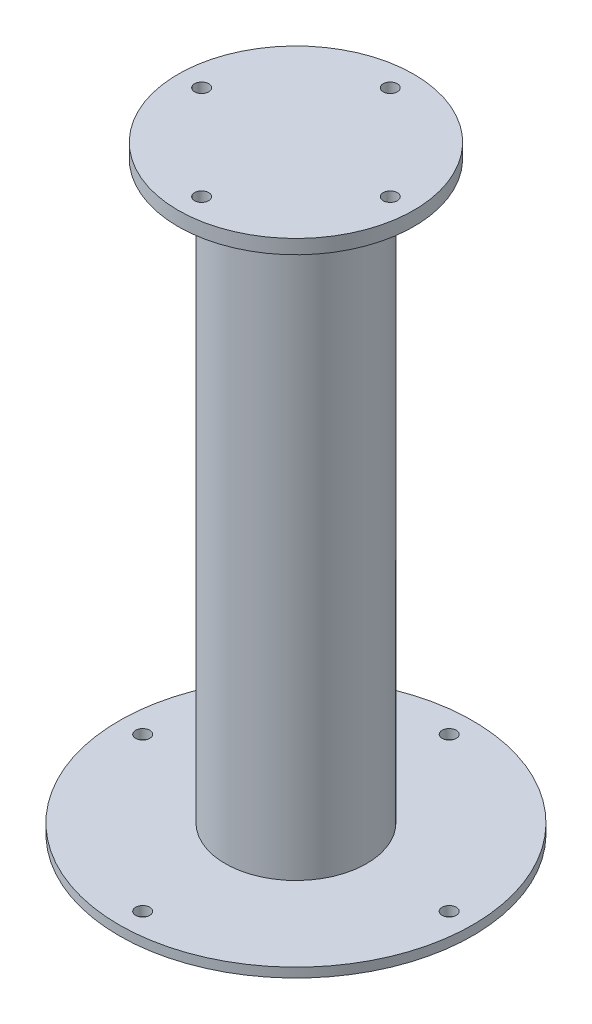
ISO-10303-21;
HEADER;
FILE_DESCRIPTION(('STEP AP214'),'2;1');
FILE_NAME('part.step','',(''),(''),'','','');
FILE_SCHEMA(('AUTOMOTIVE_DESIGN { 1 0 10303 214 1 1 1 1 }'));
ENDSEC;
DATA;
#1=APPLICATION_CONTEXT('core data for automotive mechanical design processes');
#2=APPLICATION_PROTOCOL_DEFINITION('international standard','automotive_design',2000,#1);
#3=PRODUCT_CONTEXT('',#1,'mechanical');
#4=PRODUCT('Part','Part','',(#3));
#5=PRODUCT_RELATED_PRODUCT_CATEGORY('part','',(#4));
#6=PRODUCT_DEFINITION_FORMATION('','',#4);
#7=PRODUCT_DEFINITION_CONTEXT('part definition',#1,'design');
#8=PRODUCT_DEFINITION('design','',#6,#7);
#9=PRODUCT_DEFINITION_SHAPE('','',#8);
#10=(LENGTH_UNIT() NAMED_UNIT(*) SI_UNIT(.MILLI.,.METRE.));
#11=(NAMED_UNIT(*) PLANE_ANGLE_UNIT() SI_UNIT($,.RADIAN.));
#12=(NAMED_UNIT(*) SI_UNIT($,.STERADIAN.) SOLID_ANGLE_UNIT());
#13=UNCERTAINTY_MEASURE_WITH_UNIT(LENGTH_MEASURE(1.E-05),#10,'distance_accuracy_value','');
#14=(GEOMETRIC_REPRESENTATION_CONTEXT(3) GLOBAL_UNCERTAINTY_ASSIGNED_CONTEXT((#13)) GLOBAL_UNIT_ASSIGNED_CONTEXT((#10,
#11,#12)) REPRESENTATION_CONTEXT('',''));
#15=CARTESIAN_POINT('',(0.,0.,0.));
#16=DIRECTION('',(0.,0.,1.));
#17=DIRECTION('',(1.,0.,0.));
#18=AXIS2_PLACEMENT_3D('',#15,#16,#17);
#19=CARTESIAN_POINT('',(0.,2.,0.));
#20=DIRECTION('',(0.,-1.,0.));
#21=DIRECTION('',(0.,0.,-1.));
#22=AXIS2_PLACEMENT_3D('',#19,#20,#21);
#23=CYLINDRICAL_SURFACE('',#22,37.5);
#24=CARTESIAN_POINT('',(0.,2.,0.));
#25=DIRECTION('',(0.,1.,0.));
#26=DIRECTION('',(0.,0.,1.));
#27=AXIS2_PLACEMENT_3D('',#24,#25,#26);
#28=CIRCLE('',#27,37.5);
#29=CARTESIAN_POINT('',(0.,2.,37.5));
#30=VERTEX_POINT('',#29);
#31=EDGE_CURVE('E51',#30,#30,#28,.T.);
#32=ORIENTED_EDGE('',*,*,#31,.F.);
#33=EDGE_LOOP('',(#32));
#34=FACE_BOUND('',#33,.T.);
#35=CARTESIAN_POINT('',(0.,0.,0.));
#36=DIRECTION('',(0.,1.,0.));
#37=DIRECTION('',(0.,0.,1.));
#38=AXIS2_PLACEMENT_3D('',#35,#36,#37);
#39=CIRCLE('',#38,37.5);
#40=CARTESIAN_POINT('',(0.,0.,37.5));
#41=VERTEX_POINT('',#40);
#42=EDGE_CURVE('E46',#41,#41,#39,.T.);
#43=ORIENTED_EDGE('',*,*,#42,.T.);
#44=EDGE_LOOP('',(#43));
#45=FACE_BOUND('',#44,.T.);
#46=ADVANCED_FACE('F43',(#34,#45),#23,.T.);
#47=CARTESIAN_POINT('',(0.,2.,0.));
#48=DIRECTION('',(0.,1.,0.));
#49=DIRECTION('',(0.,0.,1.));
#50=AXIS2_PLACEMENT_3D('',#47,#48,#49);
#51=PLANE('',#50);
#52=CARTESIAN_POINT('',(0.,2.,32.5));
#53=DIRECTION('',(0.,1.,0.));
#54=DIRECTION('',(0.,0.,1.));
#55=AXIS2_PLACEMENT_3D('',#52,#53,#54);
#56=CIRCLE('',#55,1.5);
#57=CARTESIAN_POINT('',(0.,2.,34.));
#58=VERTEX_POINT('',#57);
#59=EDGE_CURVE('E128',#58,#58,#56,.F.);
#60=ORIENTED_EDGE('',*,*,#59,.T.);
#61=EDGE_LOOP('',(#60));
#62=FACE_BOUND('',#61,.T.);
#63=CARTESIAN_POINT('',(32.5,2.,-1.13473143512402E-13));
#64=DIRECTION('',(0.,1.,0.));
#65=DIRECTION('',(0.,0.,1.));
#66=AXIS2_PLACEMENT_3D('',#63,#64,#65);
#67=CIRCLE('',#66,1.5);
#68=CARTESIAN_POINT('',(32.5,2.,1.49999999999989));
#69=VERTEX_POINT('',#68);
#70=EDGE_CURVE('E124',#69,#69,#67,.F.);
#71=ORIENTED_EDGE('',*,*,#70,.T.);
#72=EDGE_LOOP('',(#71));
#73=FACE_BOUND('',#72,.T.);
#74=CARTESIAN_POINT('',(-2.26946287024804E-13,2.,-32.5));
#75=DIRECTION('',(0.,1.,0.));
#76=DIRECTION('',(0.,0.,1.));
#77=AXIS2_PLACEMENT_3D('',#74,#75,#76);
#78=CIRCLE('',#77,1.5);
#79=CARTESIAN_POINT('',(-2.26946287024804E-13,2.,-31.));
#80=VERTEX_POINT('',#79);
#81=EDGE_CURVE('E116',#80,#80,#78,.F.);
#82=ORIENTED_EDGE('',*,*,#81,.T.);
#83=EDGE_LOOP('',(#82));
#84=FACE_BOUND('',#83,.T.);
#85=CARTESIAN_POINT('',(-32.5,2.,3.40419430537206E-13));
#86=DIRECTION('',(0.,1.,0.));
#87=DIRECTION('',(0.,0.,1.));
#88=AXIS2_PLACEMENT_3D('',#85,#86,#87);
#89=CIRCLE('',#88,1.5);
#90=CARTESIAN_POINT('',(-32.5,2.,1.50000000000034));
#91=VERTEX_POINT('',#90);
#92=EDGE_CURVE('E107',#91,#91,#89,.F.);
#93=ORIENTED_EDGE('',*,*,#92,.T.);
#94=EDGE_LOOP('',(#93));
#95=FACE_BOUND('',#94,.T.);
#96=CARTESIAN_POINT('',(0.,2.,0.));
#97=DIRECTION('',(0.,1.,0.));
#98=DIRECTION('',(0.,0.,1.));
#99=AXIS2_PLACEMENT_3D('',#96,#97,#98);
#100=CIRCLE('',#99,15.);
#101=CARTESIAN_POINT('',(0.,1.99999999999999,-15.));
#102=VERTEX_POINT('',#101);
#103=EDGE_CURVE('E10',#102,#102,#100,.T.);
#104=ORIENTED_EDGE('',*,*,#103,.F.);
#105=EDGE_LOOP('',(#104));
#106=FACE_BOUND('',#105,.T.);
#107=ORIENTED_EDGE('',*,*,#31,.T.);
#108=EDGE_LOOP('',(#107));
#109=FACE_BOUND('',#108,.T.);
#110=ADVANCED_FACE('F160',(#62,#73,#84,#95,#106,#109),#51,.T.);
#111=CARTESIAN_POINT('',(0.,0.,0.));
#112=DIRECTION('',(0.,1.,0.));
#113=DIRECTION('',(0.,0.,1.));
#114=AXIS2_PLACEMENT_3D('',#111,#112,#113);
#115=PLANE('',#114);
#116=CARTESIAN_POINT('',(0.,0.,0.));
#117=DIRECTION('',(0.,1.,0.));
#118=DIRECTION('',(0.,0.,1.));
#119=AXIS2_PLACEMENT_3D('',#116,#117,#118);
#120=CIRCLE('',#119,13.);
#121=CARTESIAN_POINT('',(0.,0.,-13.));
#122=VERTEX_POINT('',#121);
#123=EDGE_CURVE('E138',#122,#122,#120,.T.);
#124=ORIENTED_EDGE('',*,*,#123,.T.);
#125=EDGE_LOOP('',(#124));
#126=FACE_BOUND('',#125,.T.);
#127=CARTESIAN_POINT('',(0.,0.,32.5));
#128=DIRECTION('',(0.,-1.,0.));
#129=DIRECTION('',(0.,0.,-1.));
#130=AXIS2_PLACEMENT_3D('',#127,#128,#129);
#131=CIRCLE('',#130,1.5);
#132=CARTESIAN_POINT('',(0.,0.,31.));
#133=VERTEX_POINT('',#132);
#134=EDGE_CURVE('E80',#133,#133,#131,.T.);
#135=ORIENTED_EDGE('',*,*,#134,.F.);
#136=EDGE_LOOP('',(#135));
#137=FACE_BOUND('',#136,.T.);
#138=CARTESIAN_POINT('',(32.5,0.,-1.13473143512402E-13));
#139=DIRECTION('',(0.,-1.,0.));
#140=DIRECTION('',(0.,0.,-1.));
#141=AXIS2_PLACEMENT_3D('',#138,#139,#140);
#142=CIRCLE('',#141,1.5);
#143=CARTESIAN_POINT('',(32.5,0.,-1.50000000000011));
#144=VERTEX_POINT('',#143);
#145=EDGE_CURVE('E120',#144,#144,#142,.T.);
#146=ORIENTED_EDGE('',*,*,#145,.F.);
#147=EDGE_LOOP('',(#146));
#148=FACE_BOUND('',#147,.T.);
#149=CARTESIAN_POINT('',(-2.26946287024804E-13,0.,-32.5));
#150=DIRECTION('',(0.,-1.,0.));
#151=DIRECTION('',(0.,0.,-1.));
#152=AXIS2_PLACEMENT_3D('',#149,#150,#151);
#153=CIRCLE('',#152,1.5);
#154=CARTESIAN_POINT('',(-2.26946287024804E-13,0.,-34.));
#155=VERTEX_POINT('',#154);
#156=EDGE_CURVE('E112',#155,#155,#153,.T.);
#157=ORIENTED_EDGE('',*,*,#156,.F.);
#158=EDGE_LOOP('',(#157));
#159=FACE_BOUND('',#158,.T.);
#160=CARTESIAN_POINT('',(-32.5,0.,3.40419430537206E-13));
#161=DIRECTION('',(0.,-1.,0.));
#162=DIRECTION('',(0.,0.,-1.));
#163=AXIS2_PLACEMENT_3D('',#160,#161,#162);
#164=CIRCLE('',#163,1.5);
#165=CARTESIAN_POINT('',(-32.5,0.,-1.49999999999966));
#166=VERTEX_POINT('',#165);
#167=EDGE_CURVE('E103',#166,#166,#164,.T.);
#168=ORIENTED_EDGE('',*,*,#167,.F.);
#169=EDGE_LOOP('',(#168));
#170=FACE_BOUND('',#169,.T.);
#171=ORIENTED_EDGE('',*,*,#42,.F.);
#172=EDGE_LOOP('',(#171));
#173=FACE_BOUND('',#172,.T.);
#174=ADVANCED_FACE('F143',(#126,#137,#148,#159,#170,#173),#115,.F.);
#175=CARTESIAN_POINT('',(0.,63.,0.));
#176=DIRECTION('',(0.,-1.,0.));
#177=DIRECTION('',(0.,0.,-1.));
#178=AXIS2_PLACEMENT_3D('',#175,#176,#177);
#179=CYLINDRICAL_SURFACE('',#178,15.);
#180=CARTESIAN_POINT('',(0.,124.,0.));
#181=DIRECTION('',(0.,1.,0.));
#182=DIRECTION('',(0.,0.,1.));
#183=AXIS2_PLACEMENT_3D('',#180,#181,#182);
#184=CIRCLE('',#183,15.);
#185=CARTESIAN_POINT('',(0.,124.,-15.));
#186=VERTEX_POINT('',#185);
#187=EDGE_CURVE('E58',#186,#186,#184,.T.);
#188=CARTESIAN_POINT('',(0.,1.99999999999999,-15.));
#189=CARTESIAN_POINT('',(0.,3.27083333333333,-15.));
#190=CARTESIAN_POINT('',(0.,4.54166666666666,-15.));
#191=CARTESIAN_POINT('',(0.,7.08333333333333,-15.));
#192=CARTESIAN_POINT('',(0.,8.35416666666666,-15.));
#193=CARTESIAN_POINT('',(0.,10.8958333333333,-15.));
#194=CARTESIAN_POINT('',(0.,12.1666666666667,-15.));
#195=CARTESIAN_POINT('',(0.,14.7083333333333,-15.));
#196=CARTESIAN_POINT('',(0.,15.9791666666667,-15.));
#197=CARTESIAN_POINT('',(0.,18.5208333333333,-15.));
#198=CARTESIAN_POINT('',(0.,19.7916666666667,-15.));
#199=CARTESIAN_POINT('',(0.,22.3333333333333,-15.));
#200=CARTESIAN_POINT('',(0.,23.6041666666667,-15.));
#201=CARTESIAN_POINT('',(0.,26.1458333333333,-15.));
#202=CARTESIAN_POINT('',(0.,27.4166666666667,-15.));
#203=CARTESIAN_POINT('',(0.,29.9583333333333,-15.));
#204=CARTESIAN_POINT('',(0.,31.2291666666667,-15.));
#205=CARTESIAN_POINT('',(0.,33.7708333333333,-15.));
#206=CARTESIAN_POINT('',(0.,35.0416666666667,-15.));
#207=CARTESIAN_POINT('',(0.,37.5833333333333,-15.));
#208=CARTESIAN_POINT('',(0.,38.8541666666667,-15.));
#209=CARTESIAN_POINT('',(0.,41.3958333333333,-15.));
#210=CARTESIAN_POINT('',(0.,42.6666666666667,-15.));
#211=CARTESIAN_POINT('',(0.,45.2083333333333,-15.));
#212=CARTESIAN_POINT('',(0.,46.4791666666667,-15.));
#213=CARTESIAN_POINT('',(0.,49.0208333333333,-15.));
#214=CARTESIAN_POINT('',(0.,50.2916666666667,-15.));
#215=CARTESIAN_POINT('',(0.,52.8333333333333,-15.));
#216=CARTESIAN_POINT('',(0.,54.1041666666667,-15.));
#217=CARTESIAN_POINT('',(0.,56.6458333333333,-15.));
#218=CARTESIAN_POINT('',(0.,57.9166666666667,-15.));
#219=CARTESIAN_POINT('',(0.,60.4583333333333,-15.));
#220=CARTESIAN_POINT('',(0.,61.7291666666667,-15.));
#221=CARTESIAN_POINT('',(0.,64.2708333333333,-15.));
#222=CARTESIAN_POINT('',(0.,65.5416666666667,-15.));
#223=CARTESIAN_POINT('',(0.,68.0833333333333,-15.));
#224=CARTESIAN_POINT('',(0.,69.3541666666667,-15.));
#225=CARTESIAN_POINT('',(0.,71.8958333333333,-15.));
#226=CARTESIAN_POINT('',(0.,73.1666666666667,-15.));
#227=CARTESIAN_POINT('',(0.,75.7083333333333,-15.));
#228=CARTESIAN_POINT('',(0.,76.9791666666667,-15.));
#229=CARTESIAN_POINT('',(0.,79.5208333333333,-15.));
#230=CARTESIAN_POINT('',(0.,80.7916666666667,-15.));
#231=CARTESIAN_POINT('',(0.,83.3333333333333,-15.));
#232=CARTESIAN_POINT('',(0.,84.6041666666667,-15.));
#233=CARTESIAN_POINT('',(0.,87.1458333333333,-15.));
#234=CARTESIAN_POINT('',(0.,88.4166666666667,-15.));
#235=CARTESIAN_POINT('',(0.,90.9583333333333,-15.));
#236=CARTESIAN_POINT('',(0.,92.2291666666667,-15.));
#237=CARTESIAN_POINT('',(0.,94.7708333333333,-15.));
#238=CARTESIAN_POINT('',(0.,96.0416666666667,-15.));
#239=CARTESIAN_POINT('',(0.,98.5833333333333,-15.));
#240=CARTESIAN_POINT('',(0.,99.8541666666667,-15.));
#241=CARTESIAN_POINT('',(0.,102.395833333333,-15.));
#242=CARTESIAN_POINT('',(0.,103.666666666667,-15.));
#243=CARTESIAN_POINT('',(0.,106.208333333333,-15.));
#244=CARTESIAN_POINT('',(0.,107.479166666667,-15.));
#245=CARTESIAN_POINT('',(0.,110.020833333333,-15.));
#246=CARTESIAN_POINT('',(0.,111.291666666667,-15.));
#247=CARTESIAN_POINT('',(0.,113.833333333333,-15.));
#248=CARTESIAN_POINT('',(0.,115.104166666667,-15.));
#249=CARTESIAN_POINT('',(0.,117.645833333333,-15.));
#250=CARTESIAN_POINT('',(0.,118.916666666667,-15.));
#251=CARTESIAN_POINT('',(0.,121.458333333333,-15.));
#252=CARTESIAN_POINT('',(0.,122.729166666667,-15.));
#253=CARTESIAN_POINT('',(0.,124.,-15.));
#254=B_SPLINE_CURVE_WITH_KNOTS('',3,(#188,#189,#190,#191,#192,#193,#194,#195,#196,#197,#198,
#199,#200,#201,#202,#203,#204,#205,#206,#207,#208,#209,#210,#211,#212,#213,#214,#215,#216,#217,
#218,#219,#220,#221,#222,#223,#224,#225,#226,#227,#228,#229,#230,#231,#232,#233,#234,#235,#236,
#237,#238,#239,#240,#241,#242,#243,#244,#245,#246,#247,#248,#249,#250,#251,#252,#253),
.UNSPECIFIED.,.F.,.F.,(4,2,2,2,2,2,2,2,2,2,2,2,2,2,2,2,2,2,2,2,2,2,2,2,2,2,2,2,2,2,2,2,4),(0.,
3.8125,7.625,11.4375,15.25,19.0625,22.875,26.6875,30.5,34.3125,38.125,41.9375,45.75,49.5625,
53.375,57.1875,61.,64.8125,68.625,72.4375,76.25,80.0625,83.875,87.6875,91.5,95.3125,99.125,
102.9375,106.75,110.5625,114.375,118.1875,122.),.UNSPECIFIED.);
#255=EDGE_CURVE('BSEAM175',#102,#186,#254,.T.);
#256=ORIENTED_EDGE('',*,*,#103,.T.);
#257=ORIENTED_EDGE('',*,*,#187,.F.);
#258=ORIENTED_EDGE('',*,*,#255,.T.);
#259=ORIENTED_EDGE('',*,*,#255,.F.);
#260=EDGE_LOOP('',(#256,#258,#257,#259));
#261=FACE_BOUND('',#260,.T.);
#262=ADVANCED_FACE('F175',(#261),#179,.T.);
#263=CARTESIAN_POINT('',(0.,127.,0.));
#264=DIRECTION('',(0.,-1.,0.));
#265=DIRECTION('',(0.,0.,-1.));
#266=AXIS2_PLACEMENT_3D('',#263,#264,#265);
#267=CYLINDRICAL_SURFACE('',#266,25.);
#268=CARTESIAN_POINT('',(0.,127.,0.));
#269=DIRECTION('',(0.,1.,0.));
#270=DIRECTION('',(0.,0.,1.));
#271=AXIS2_PLACEMENT_3D('',#268,#269,#270);
#272=CIRCLE('',#271,25.);
#273=CARTESIAN_POINT('',(0.,127.,25.));
#274=VERTEX_POINT('',#273);
#275=EDGE_CURVE('E62',#274,#274,#272,.T.);
#276=ORIENTED_EDGE('',*,*,#275,.F.);
#277=EDGE_LOOP('',(#276));
#278=FACE_BOUND('',#277,.T.);
#279=CARTESIAN_POINT('',(0.,124.,0.));
#280=DIRECTION('',(0.,1.,0.));
#281=DIRECTION('',(0.,0.,1.));
#282=AXIS2_PLACEMENT_3D('',#279,#280,#281);
#283=CIRCLE('',#282,25.);
#284=CARTESIAN_POINT('',(0.,124.,25.));
#285=VERTEX_POINT('',#284);
#286=EDGE_CURVE('E63',#285,#285,#283,.T.);
#287=ORIENTED_EDGE('',*,*,#286,.T.);
#288=EDGE_LOOP('',(#287));
#289=FACE_BOUND('',#288,.T.);
#290=ADVANCED_FACE('F179',(#278,#289),#267,.T.);
#291=CARTESIAN_POINT('',(0.,127.,0.));
#292=DIRECTION('',(0.,1.,0.));
#293=DIRECTION('',(0.,0.,1.));
#294=AXIS2_PLACEMENT_3D('',#291,#292,#293);
#295=PLANE('',#294);
#296=CARTESIAN_POINT('',(0.,127.,-20.));
#297=DIRECTION('',(0.,1.,0.));
#298=DIRECTION('',(0.,0.,1.));
#299=AXIS2_PLACEMENT_3D('',#296,#297,#298);
#300=CIRCLE('',#299,1.5);
#301=CARTESIAN_POINT('',(0.,127.,-18.5));
#302=VERTEX_POINT('',#301);
#303=EDGE_CURVE('E67',#302,#302,#300,.T.);
#304=ORIENTED_EDGE('',*,*,#303,.F.);
#305=EDGE_LOOP('',(#304));
#306=FACE_BOUND('',#305,.T.);
#307=CARTESIAN_POINT('',(20.,127.,0.));
#308=DIRECTION('',(0.,1.,0.));
#309=DIRECTION('',(0.,0.,1.));
#310=AXIS2_PLACEMENT_3D('',#307,#308,#309);
#311=CIRCLE('',#310,1.5);
#312=CARTESIAN_POINT('',(20.,127.,1.50000000000007));
#313=VERTEX_POINT('',#312);
#314=EDGE_CURVE('E85',#313,#313,#311,.T.);
#315=ORIENTED_EDGE('',*,*,#314,.F.);
#316=EDGE_LOOP('',(#315));
#317=FACE_BOUND('',#316,.T.);
#318=CARTESIAN_POINT('',(-1.39659253553725E-13,127.,20.));
#319=DIRECTION('',(0.,1.,0.));
#320=DIRECTION('',(0.,0.,1.));
#321=AXIS2_PLACEMENT_3D('',#318,#319,#320);
#322=CIRCLE('',#321,1.5);
#323=CARTESIAN_POINT('',(-1.39659253553725E-13,127.,21.5));
#324=VERTEX_POINT('',#323);
#325=EDGE_CURVE('E75',#324,#324,#322,.T.);
#326=ORIENTED_EDGE('',*,*,#325,.F.);
#327=EDGE_LOOP('',(#326));
#328=FACE_BOUND('',#327,.T.);
#329=CARTESIAN_POINT('',(-20.,127.,-2.09488880330588E-13));
#330=DIRECTION('',(0.,1.,0.));
#331=DIRECTION('',(0.,0.,1.));
#332=AXIS2_PLACEMENT_3D('',#329,#330,#331);
#333=CIRCLE('',#332,1.5);
#334=CARTESIAN_POINT('',(-20.,127.,1.49999999999979));
#335=VERTEX_POINT('',#334);
#336=EDGE_CURVE('E76',#335,#335,#333,.T.);
#337=ORIENTED_EDGE('',*,*,#336,.F.);
#338=EDGE_LOOP('',(#337));
#339=FACE_BOUND('',#338,.T.);
#340=ORIENTED_EDGE('',*,*,#275,.T.);
#341=EDGE_LOOP('',(#340));
#342=FACE_BOUND('',#341,.T.);
#343=ADVANCED_FACE('F184',(#306,#317,#328,#339,#342),#295,.T.);
#344=CARTESIAN_POINT('',(0.,124.,0.));
#345=DIRECTION('',(0.,1.,0.));
#346=DIRECTION('',(0.,0.,1.));
#347=AXIS2_PLACEMENT_3D('',#344,#345,#346);
#348=PLANE('',#347);
#349=CARTESIAN_POINT('',(0.,124.,-20.));
#350=DIRECTION('',(0.,1.,0.));
#351=DIRECTION('',(0.,0.,1.));
#352=AXIS2_PLACEMENT_3D('',#349,#350,#351);
#353=CIRCLE('',#352,1.5);
#354=CARTESIAN_POINT('',(0.,124.,-18.5));
#355=VERTEX_POINT('',#354);
#356=EDGE_CURVE('E93',#355,#355,#353,.F.);
#357=ORIENTED_EDGE('',*,*,#356,.F.);
#358=EDGE_LOOP('',(#357));
#359=FACE_BOUND('',#358,.T.);
#360=CARTESIAN_POINT('',(20.,124.,0.));
#361=DIRECTION('',(0.,1.,0.));
#362=DIRECTION('',(0.,0.,1.));
#363=AXIS2_PLACEMENT_3D('',#360,#361,#362);
#364=CIRCLE('',#363,1.5);
#365=CARTESIAN_POINT('',(20.,124.,1.50000000000007));
#366=VERTEX_POINT('',#365);
#367=EDGE_CURVE('E89',#366,#366,#364,.F.);
#368=ORIENTED_EDGE('',*,*,#367,.F.);
#369=EDGE_LOOP('',(#368));
#370=FACE_BOUND('',#369,.T.);
#371=CARTESIAN_POINT('',(-1.39659253553725E-13,124.,20.));
#372=DIRECTION('',(0.,1.,0.));
#373=DIRECTION('',(0.,0.,1.));
#374=AXIS2_PLACEMENT_3D('',#371,#372,#373);
#375=CIRCLE('',#374,1.5);
#376=CARTESIAN_POINT('',(-1.39659253553725E-13,124.,21.5));
#377=VERTEX_POINT('',#376);
#378=EDGE_CURVE('E81',#377,#377,#375,.F.);
#379=ORIENTED_EDGE('',*,*,#378,.F.);
#380=EDGE_LOOP('',(#379));
#381=FACE_BOUND('',#380,.T.);
#382=CARTESIAN_POINT('',(-20.,124.,-2.09488880330588E-13));
#383=DIRECTION('',(0.,1.,0.));
#384=DIRECTION('',(0.,0.,1.));
#385=AXIS2_PLACEMENT_3D('',#382,#383,#384);
#386=CIRCLE('',#385,1.5);
#387=CARTESIAN_POINT('',(-20.,124.,1.49999999999979));
#388=VERTEX_POINT('',#387);
#389=EDGE_CURVE('E71',#388,#388,#386,.F.);
#390=ORIENTED_EDGE('',*,*,#389,.F.);
#391=EDGE_LOOP('',(#390));
#392=FACE_BOUND('',#391,.T.);
#393=ORIENTED_EDGE('',*,*,#187,.T.);
#394=EDGE_LOOP('',(#393));
#395=FACE_BOUND('',#394,.T.);
#396=ORIENTED_EDGE('',*,*,#286,.F.);
#397=EDGE_LOOP('',(#396));
#398=FACE_BOUND('',#397,.T.);
#399=ADVANCED_FACE('F186',(#359,#370,#381,#392,#395,#398),#348,.F.);
#400=CARTESIAN_POINT('',(-20.,-0.001000000000001,-2.09488880330588E-13));
#401=DIRECTION('',(0.,1.,0.));
#402=DIRECTION('',(0.,0.,1.));
#403=AXIS2_PLACEMENT_3D('',#400,#401,#402);
#404=CYLINDRICAL_SURFACE('',#403,1.5);
#405=ORIENTED_EDGE('',*,*,#336,.T.);
#406=EDGE_LOOP('',(#405));
#407=FACE_BOUND('',#406,.T.);
#408=ORIENTED_EDGE('',*,*,#389,.T.);
#409=EDGE_LOOP('',(#408));
#410=FACE_BOUND('',#409,.T.);
#411=ADVANCED_FACE('F189',(#407,#410),#404,.F.);
#412=CARTESIAN_POINT('',(-1.39659253553725E-13,-0.001000000000001,20.));
#413=DIRECTION('',(0.,1.,0.));
#414=DIRECTION('',(0.,0.,1.));
#415=AXIS2_PLACEMENT_3D('',#412,#413,#414);
#416=CYLINDRICAL_SURFACE('',#415,1.5);
#417=ORIENTED_EDGE('',*,*,#325,.T.);
#418=EDGE_LOOP('',(#417));
#419=FACE_BOUND('',#418,.T.);
#420=ORIENTED_EDGE('',*,*,#378,.T.);
#421=EDGE_LOOP('',(#420));
#422=FACE_BOUND('',#421,.T.);
#423=ADVANCED_FACE('F196',(#419,#422),#416,.F.);
#424=CARTESIAN_POINT('',(20.,-0.001000000000001,0.));
#425=DIRECTION('',(0.,1.,0.));
#426=DIRECTION('',(0.,0.,1.));
#427=AXIS2_PLACEMENT_3D('',#424,#425,#426);
#428=CYLINDRICAL_SURFACE('',#427,1.5);
#429=ORIENTED_EDGE('',*,*,#314,.T.);
#430=EDGE_LOOP('',(#429));
#431=FACE_BOUND('',#430,.T.);
#432=ORIENTED_EDGE('',*,*,#367,.T.);
#433=EDGE_LOOP('',(#432));
#434=FACE_BOUND('',#433,.T.);
#435=ADVANCED_FACE('F200',(#431,#434),#428,.F.);
#436=CARTESIAN_POINT('',(0.,-0.001000000000001,-20.));
#437=DIRECTION('',(0.,1.,0.));
#438=DIRECTION('',(0.,0.,1.));
#439=AXIS2_PLACEMENT_3D('',#436,#437,#438);
#440=CYLINDRICAL_SURFACE('',#439,1.5);
#441=ORIENTED_EDGE('',*,*,#303,.T.);
#442=EDGE_LOOP('',(#441));
#443=FACE_BOUND('',#442,.T.);
#444=ORIENTED_EDGE('',*,*,#356,.T.);
#445=EDGE_LOOP('',(#444));
#446=FACE_BOUND('',#445,.T.);
#447=ADVANCED_FACE('F204',(#443,#446),#440,.F.);
#448=CARTESIAN_POINT('',(-32.5,127.001,3.40419430537206E-13));
#449=DIRECTION('',(0.,-1.,0.));
#450=DIRECTION('',(0.,0.,-1.));
#451=AXIS2_PLACEMENT_3D('',#448,#449,#450);
#452=CYLINDRICAL_SURFACE('',#451,1.5);
#453=ORIENTED_EDGE('',*,*,#92,.F.);
#454=EDGE_LOOP('',(#453));
#455=FACE_BOUND('',#454,.T.);
#456=ORIENTED_EDGE('',*,*,#167,.T.);
#457=EDGE_LOOP('',(#456));
#458=FACE_BOUND('',#457,.T.);
#459=ADVANCED_FACE('F208',(#455,#458),#452,.F.);
#460=CARTESIAN_POINT('',(-2.26946287024804E-13,127.001,-32.5));
#461=DIRECTION('',(0.,-1.,0.));
#462=DIRECTION('',(0.,0.,-1.));
#463=AXIS2_PLACEMENT_3D('',#460,#461,#462);
#464=CYLINDRICAL_SURFACE('',#463,1.5);
#465=ORIENTED_EDGE('',*,*,#81,.F.);
#466=EDGE_LOOP('',(#465));
#467=FACE_BOUND('',#466,.T.);
#468=ORIENTED_EDGE('',*,*,#156,.T.);
#469=EDGE_LOOP('',(#468));
#470=FACE_BOUND('',#469,.T.);
#471=ADVANCED_FACE('F212',(#467,#470),#464,.F.);
#472=CARTESIAN_POINT('',(32.5,127.001,-1.13473143512402E-13));
#473=DIRECTION('',(0.,-1.,0.));
#474=DIRECTION('',(0.,0.,-1.));
#475=AXIS2_PLACEMENT_3D('',#472,#473,#474);
#476=CYLINDRICAL_SURFACE('',#475,1.5);
#477=ORIENTED_EDGE('',*,*,#70,.F.);
#478=EDGE_LOOP('',(#477));
#479=FACE_BOUND('',#478,.T.);
#480=ORIENTED_EDGE('',*,*,#145,.T.);
#481=EDGE_LOOP('',(#480));
#482=FACE_BOUND('',#481,.T.);
#483=ADVANCED_FACE('F216',(#479,#482),#476,.F.);
#484=CARTESIAN_POINT('',(0.,127.001,32.5));
#485=DIRECTION('',(0.,-1.,0.));
#486=DIRECTION('',(0.,0.,-1.));
#487=AXIS2_PLACEMENT_3D('',#484,#485,#486);
#488=CYLINDRICAL_SURFACE('',#487,1.5);
#489=ORIENTED_EDGE('',*,*,#59,.F.);
#490=EDGE_LOOP('',(#489));
#491=FACE_BOUND('',#490,.T.);
#492=ORIENTED_EDGE('',*,*,#134,.T.);
#493=EDGE_LOOP('',(#492));
#494=FACE_BOUND('',#493,.T.);
#495=ADVANCED_FACE('F150',(#491,#494),#488,.F.);
#496=CARTESIAN_POINT('',(0.,63.,0.));
#497=DIRECTION('',(0.,-1.,0.));
#498=DIRECTION('',(0.,0.,-1.));
#499=AXIS2_PLACEMENT_3D('',#496,#497,#498);
#500=CYLINDRICAL_SURFACE('',#499,13.);
#501=CARTESIAN_POINT('',(0.,125.,0.));
#502=DIRECTION('',(0.,1.,0.));
#503=DIRECTION('',(0.,0.,1.));
#504=AXIS2_PLACEMENT_3D('',#501,#502,#503);
#505=CIRCLE('',#504,13.);
#506=CARTESIAN_POINT('',(0.,125.,-13.));
#507=VERTEX_POINT('',#506);
#508=EDGE_CURVE('E108',#507,#507,#505,.F.);
#509=CARTESIAN_POINT('',(0.,0.,-13.));
#510=CARTESIAN_POINT('',(0.,1.30208333333332,-13.));
#511=CARTESIAN_POINT('',(0.,2.60416666666665,-13.));
#512=CARTESIAN_POINT('',(0.,5.20833333333331,-13.));
#513=CARTESIAN_POINT('',(0.,6.51041666666665,-13.));
#514=CARTESIAN_POINT('',(0.,9.11458333333331,-13.));
#515=CARTESIAN_POINT('',(0.,10.4166666666666,-13.));
#516=CARTESIAN_POINT('',(0.,13.0208333333333,-13.));
#517=CARTESIAN_POINT('',(0.,14.3229166666666,-13.));
#518=CARTESIAN_POINT('',(0.,16.9270833333333,-13.));
#519=CARTESIAN_POINT('',(0.,18.2291666666666,-13.));
#520=CARTESIAN_POINT('',(0.,20.8333333333333,-13.));
#521=CARTESIAN_POINT('',(0.,22.1354166666667,-13.));
#522=CARTESIAN_POINT('',(0.,24.7395833333333,-13.));
#523=CARTESIAN_POINT('',(0.,26.0416666666667,-13.));
#524=CARTESIAN_POINT('',(0.,28.6458333333333,-13.));
#525=CARTESIAN_POINT('',(0.,29.9479166666667,-13.));
#526=CARTESIAN_POINT('',(0.,32.5520833333333,-13.));
#527=CARTESIAN_POINT('',(0.,33.8541666666667,-13.));
#528=CARTESIAN_POINT('',(0.,36.4583333333333,-13.));
#529=CARTESIAN_POINT('',(0.,37.7604166666667,-13.));
#530=CARTESIAN_POINT('',(0.,40.3645833333333,-13.));
#531=CARTESIAN_POINT('',(0.,41.6666666666667,-13.));
#532=CARTESIAN_POINT('',(0.,44.2708333333333,-13.));
#533=CARTESIAN_POINT('',(0.,45.5729166666667,-13.));
#534=CARTESIAN_POINT('',(0.,48.1770833333333,-13.));
#535=CARTESIAN_POINT('',(0.,49.4791666666667,-13.));
#536=CARTESIAN_POINT('',(0.,52.0833333333333,-13.));
#537=CARTESIAN_POINT('',(0.,53.3854166666667,-13.));
#538=CARTESIAN_POINT('',(0.,55.9895833333333,-13.));
#539=CARTESIAN_POINT('',(0.,57.2916666666667,-13.));
#540=CARTESIAN_POINT('',(0.,59.8958333333333,-13.));
#541=CARTESIAN_POINT('',(0.,61.1979166666667,-13.));
#542=CARTESIAN_POINT('',(0.,63.8020833333333,-13.));
#543=CARTESIAN_POINT('',(0.,65.1041666666667,-13.));
#544=CARTESIAN_POINT('',(0.,67.7083333333333,-13.));
#545=CARTESIAN_POINT('',(0.,69.0104166666667,-13.));
#546=CARTESIAN_POINT('',(0.,71.6145833333333,-13.));
#547=CARTESIAN_POINT('',(0.,72.9166666666667,-13.));
#548=CARTESIAN_POINT('',(0.,75.5208333333333,-13.));
#549=CARTESIAN_POINT('',(0.,76.8229166666667,-13.));
#550=CARTESIAN_POINT('',(0.,79.4270833333333,-13.));
#551=CARTESIAN_POINT('',(0.,80.7291666666667,-13.));
#552=CARTESIAN_POINT('',(0.,83.3333333333333,-13.));
#553=CARTESIAN_POINT('',(0.,84.6354166666667,-13.));
#554=CARTESIAN_POINT('',(0.,87.2395833333333,-13.));
#555=CARTESIAN_POINT('',(0.,88.5416666666667,-13.));
#556=CARTESIAN_POINT('',(0.,91.1458333333333,-13.));
#557=CARTESIAN_POINT('',(0.,92.4479166666667,-13.));
#558=CARTESIAN_POINT('',(0.,95.0520833333333,-13.));
#559=CARTESIAN_POINT('',(0.,96.3541666666667,-13.));
#560=CARTESIAN_POINT('',(0.,98.9583333333333,-13.));
#561=CARTESIAN_POINT('',(0.,100.260416666667,-13.));
#562=CARTESIAN_POINT('',(0.,102.864583333333,-13.));
#563=CARTESIAN_POINT('',(0.,104.166666666667,-13.));
#564=CARTESIAN_POINT('',(0.,106.770833333333,-13.));
#565=CARTESIAN_POINT('',(0.,108.072916666667,-13.));
#566=CARTESIAN_POINT('',(0.,110.677083333333,-13.));
#567=CARTESIAN_POINT('',(0.,111.979166666667,-13.));
#568=CARTESIAN_POINT('',(0.,114.583333333333,-13.));
#569=CARTESIAN_POINT('',(0.,115.885416666667,-13.));
#570=CARTESIAN_POINT('',(0.,118.489583333333,-13.));
#571=CARTESIAN_POINT('',(0.,119.791666666667,-13.));
#572=CARTESIAN_POINT('',(0.,122.395833333333,-13.));
#573=CARTESIAN_POINT('',(0.,123.697916666667,-13.));
#574=CARTESIAN_POINT('',(0.,125.,-13.));
#575=B_SPLINE_CURVE_WITH_KNOTS('',3,(#509,#510,#511,#512,#513,#514,#515,#516,#517,#518,#519,
#520,#521,#522,#523,#524,#525,#526,#527,#528,#529,#530,#531,#532,#533,#534,#535,#536,#537,#538,
#539,#540,#541,#542,#543,#544,#545,#546,#547,#548,#549,#550,#551,#552,#553,#554,#555,#556,#557,
#558,#559,#560,#561,#562,#563,#564,#565,#566,#567,#568,#569,#570,#571,#572,#573,#574),
.UNSPECIFIED.,.F.,.F.,(4,2,2,2,2,2,2,2,2,2,2,2,2,2,2,2,2,2,2,2,2,2,2,2,2,2,2,2,2,2,2,2,4),(0.,
3.90624999999999,7.81249999999999,11.71875,15.625,19.53125,23.4375,27.34375,31.25,35.15625,
39.0625,42.96875,46.875,50.78125,54.6875,58.59375,62.5,66.40625,70.3125,74.21875,78.125,
82.03125,85.9375,89.84375,93.75,97.65625,101.5625,105.46875,109.375,113.28125,117.1875,
121.09375,125.),.UNSPECIFIED.);
#576=EDGE_CURVE('BSEAM146',#122,#507,#575,.T.);
#577=ORIENTED_EDGE('',*,*,#123,.F.);
#578=ORIENTED_EDGE('',*,*,#508,.F.);
#579=ORIENTED_EDGE('',*,*,#576,.T.);
#580=ORIENTED_EDGE('',*,*,#576,.F.);
#581=EDGE_LOOP('',(#577,#579,#578,#580));
#582=FACE_BOUND('',#581,.T.);
#583=ADVANCED_FACE('F146',(#582),#500,.F.);
#584=CARTESIAN_POINT('',(0.,125.,0.));
#585=DIRECTION('',(0.,1.,0.));
#586=DIRECTION('',(0.,0.,1.));
#587=AXIS2_PLACEMENT_3D('',#584,#585,#586);
#588=PLANE('',#587);
#589=ORIENTED_EDGE('',*,*,#508,.T.);
#590=EDGE_LOOP('',(#589));
#591=FACE_BOUND('',#590,.T.);
#592=ADVANCED_FACE('F149',(#591),#588,.F.);
#593=CLOSED_SHELL('',(#46,#110,#174,#262,#290,#343,#399,#411,#423,#435,#447,#459,#471,#483,#495,
#583,#592));
#594=MANIFOLD_SOLID_BREP('B2',#593);
#595=ADVANCED_BREP_SHAPE_REPRESENTATION('',(#18,#594),#14);
#596=SHAPE_DEFINITION_REPRESENTATION(#9,#595);
ENDSEC;
END-ISO-10303-21;
